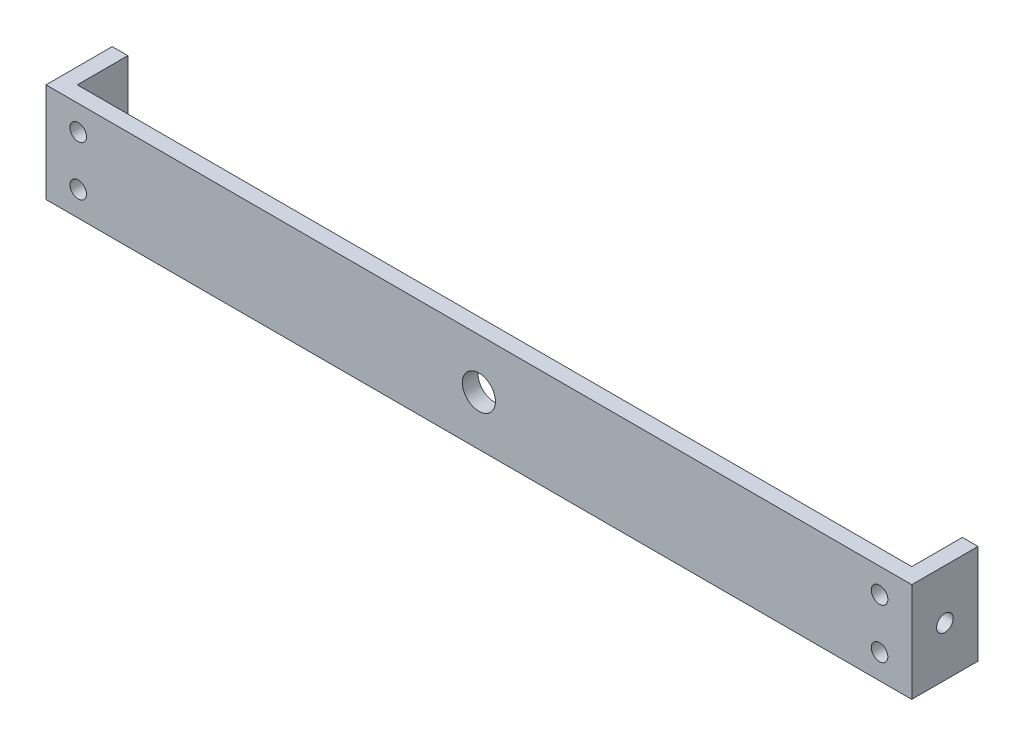
ISO-10303-21;
HEADER;
FILE_DESCRIPTION(('STEP AP214'),'2;1');
FILE_NAME('part.step','',(''),(''),'','','');
FILE_SCHEMA(('AUTOMOTIVE_DESIGN { 1 0 10303 214 1 1 1 1 }'));
ENDSEC;
DATA;
#1=APPLICATION_CONTEXT('core data for automotive mechanical design processes');
#2=APPLICATION_PROTOCOL_DEFINITION('international standard','automotive_design',2000,#1);
#3=PRODUCT_CONTEXT('',#1,'mechanical');
#4=PRODUCT('Part','Part','',(#3));
#5=PRODUCT_RELATED_PRODUCT_CATEGORY('part','',(#4));
#6=PRODUCT_DEFINITION_FORMATION('','',#4);
#7=PRODUCT_DEFINITION_CONTEXT('part definition',#1,'design');
#8=PRODUCT_DEFINITION('design','',#6,#7);
#9=PRODUCT_DEFINITION_SHAPE('','',#8);
#10=(LENGTH_UNIT() NAMED_UNIT(*) SI_UNIT(.MILLI.,.METRE.));
#11=(NAMED_UNIT(*) PLANE_ANGLE_UNIT() SI_UNIT($,.RADIAN.));
#12=(NAMED_UNIT(*) SI_UNIT($,.STERADIAN.) SOLID_ANGLE_UNIT());
#13=UNCERTAINTY_MEASURE_WITH_UNIT(LENGTH_MEASURE(1.E-05),#10,'distance_accuracy_value','');
#14=(GEOMETRIC_REPRESENTATION_CONTEXT(3) GLOBAL_UNCERTAINTY_ASSIGNED_CONTEXT((#13)) GLOBAL_UNIT_ASSIGNED_CONTEXT((#10,
#11,#12)) REPRESENTATION_CONTEXT('',''));
#15=CARTESIAN_POINT('',(0.,0.,0.));
#16=DIRECTION('',(0.,0.,1.));
#17=DIRECTION('',(1.,0.,0.));
#18=AXIS2_PLACEMENT_3D('',#15,#16,#17);
#19=CARTESIAN_POINT('',(0.,0.,6.));
#20=DIRECTION('',(0.,0.,1.));
#21=DIRECTION('',(1.,0.,0.));
#22=AXIS2_PLACEMENT_3D('',#19,#20,#21);
#23=PLANE('',#22);
#24=CARTESIAN_POINT('',(-153.65,-9.52499999999999,6.));
#25=DIRECTION('',(0.,0.,1.));
#26=DIRECTION('',(1.,0.,0.));
#27=AXIS2_PLACEMENT_3D('',#24,#25,#26);
#28=CIRCLE('',#27,3.175);
#29=CARTESIAN_POINT('',(-150.475,-9.52499999999999,6.));
#30=VERTEX_POINT('',#29);
#31=EDGE_CURVE('E375',#30,#30,#28,.T.);
#32=ORIENTED_EDGE('',*,*,#31,.F.);
#33=EDGE_LOOP('',(#32));
#34=FACE_BOUND('',#33,.T.);
#35=CARTESIAN_POINT('',(153.65,-9.52499999999999,6.));
#36=DIRECTION('',(0.,0.,1.));
#37=DIRECTION('',(1.,0.,0.));
#38=AXIS2_PLACEMENT_3D('',#35,#36,#37);
#39=CIRCLE('',#38,3.175);
#40=CARTESIAN_POINT('',(156.825,-9.52499999999999,6.));
#41=VERTEX_POINT('',#40);
#42=EDGE_CURVE('E372',#41,#41,#39,.T.);
#43=ORIENTED_EDGE('',*,*,#42,.F.);
#44=EDGE_LOOP('',(#43));
#45=FACE_BOUND('',#44,.T.);
#46=CARTESIAN_POINT('',(153.65,9.52500000000004,6.));
#47=DIRECTION('',(0.,0.,1.));
#48=DIRECTION('',(1.,0.,0.));
#49=AXIS2_PLACEMENT_3D('',#46,#47,#48);
#50=CIRCLE('',#49,3.175);
#51=CARTESIAN_POINT('',(156.825,9.52500000000004,6.));
#52=VERTEX_POINT('',#51);
#53=EDGE_CURVE('E364',#52,#52,#50,.T.);
#54=ORIENTED_EDGE('',*,*,#53,.F.);
#55=EDGE_LOOP('',(#54));
#56=FACE_BOUND('',#55,.T.);
#57=CARTESIAN_POINT('',(-153.65,9.52500000000004,6.));
#58=DIRECTION('',(0.,0.,1.));
#59=DIRECTION('',(1.,0.,0.));
#60=AXIS2_PLACEMENT_3D('',#57,#58,#59);
#61=CIRCLE('',#60,3.175);
#62=CARTESIAN_POINT('',(-150.475,9.52500000000004,6.));
#63=VERTEX_POINT('',#62);
#64=EDGE_CURVE('E124',#63,#63,#61,.T.);
#65=ORIENTED_EDGE('',*,*,#64,.F.);
#66=EDGE_LOOP('',(#65));
#67=FACE_BOUND('',#66,.T.);
#68=DIRECTION('',(-1.,0.,0.));
#69=VECTOR('',#68,1.);
#70=CARTESIAN_POINT('',(160.,19.0500000000001,6.));
#71=LINE('',#70,#69);
#72=CARTESIAN_POINT('',(166.,19.0500000000001,6.));
#73=VERTEX_POINT('',#72);
#74=CARTESIAN_POINT('',(-166.,19.05,6.));
#75=VERTEX_POINT('',#74);
#76=EDGE_CURVE('E11',#73,#75,#71,.T.);
#77=ORIENTED_EDGE('',*,*,#76,.T.);
#78=DIRECTION('',(0.,-1.,0.));
#79=VECTOR('',#78,1.);
#80=CARTESIAN_POINT('',(-166.,19.05,6.));
#81=LINE('',#80,#79);
#82=CARTESIAN_POINT('',(-166.,-19.05,6.));
#83=VERTEX_POINT('',#82);
#84=EDGE_CURVE('E121',#75,#83,#81,.T.);
#85=ORIENTED_EDGE('',*,*,#84,.T.);
#86=DIRECTION('',(1.,0.,0.));
#87=VECTOR('',#86,1.);
#88=CARTESIAN_POINT('',(160.,-19.05,6.));
#89=LINE('',#88,#87);
#90=CARTESIAN_POINT('',(166.,-19.05,6.));
#91=VERTEX_POINT('',#90);
#92=EDGE_CURVE('E42',#83,#91,#89,.T.);
#93=ORIENTED_EDGE('',*,*,#92,.T.);
#94=DIRECTION('',(0.,1.,0.));
#95=VECTOR('',#94,1.);
#96=CARTESIAN_POINT('',(166.,19.0500000000001,6.));
#97=LINE('',#96,#95);
#98=EDGE_CURVE('E132',#91,#73,#97,.T.);
#99=ORIENTED_EDGE('',*,*,#98,.T.);
#100=EDGE_LOOP('',(#77,#85,#93,#99));
#101=FACE_BOUND('',#100,.T.);
#102=CARTESIAN_POINT('',(0.,0.,6.));
#103=DIRECTION('',(0.,0.,1.));
#104=DIRECTION('',(1.,0.,0.));
#105=AXIS2_PLACEMENT_3D('',#102,#103,#104);
#106=CIRCLE('',#105,6.35);
#107=CARTESIAN_POINT('',(6.35000000000006,0.,6.));
#108=VERTEX_POINT('',#107);
#109=EDGE_CURVE('E163',#108,#108,#106,.T.);
#110=ORIENTED_EDGE('',*,*,#109,.F.);
#111=EDGE_LOOP('',(#110));
#112=FACE_BOUND('',#111,.T.);
#113=ADVANCED_FACE('F33',(#34,#45,#56,#67,#101,#112),#23,.T.);
#114=CARTESIAN_POINT('',(0.,0.,0.));
#115=DIRECTION('',(0.,0.,1.));
#116=DIRECTION('',(1.,0.,0.));
#117=AXIS2_PLACEMENT_3D('',#114,#115,#116);
#118=PLANE('',#117);
#119=CARTESIAN_POINT('',(-153.65,-9.52499999999999,0.));
#120=DIRECTION('',(0.,0.,-1.));
#121=DIRECTION('',(-1.,0.,0.));
#122=AXIS2_PLACEMENT_3D('',#119,#120,#121);
#123=CIRCLE('',#122,3.175);
#124=CARTESIAN_POINT('',(-156.825,-9.52499999999999,0.));
#125=VERTEX_POINT('',#124);
#126=EDGE_CURVE('E361',#125,#125,#123,.T.);
#127=ORIENTED_EDGE('',*,*,#126,.F.);
#128=EDGE_LOOP('',(#127));
#129=FACE_BOUND('',#128,.T.);
#130=CARTESIAN_POINT('',(153.65,-9.52499999999999,0.));
#131=DIRECTION('',(0.,0.,-1.));
#132=DIRECTION('',(1.,0.,0.));
#133=AXIS2_PLACEMENT_3D('',#130,#131,#132);
#134=CIRCLE('',#133,3.175);
#135=CARTESIAN_POINT('',(156.825,-9.52499999999999,0.));
#136=VERTEX_POINT('',#135);
#137=EDGE_CURVE('E365',#136,#136,#134,.T.);
#138=ORIENTED_EDGE('',*,*,#137,.F.);
#139=EDGE_LOOP('',(#138));
#140=FACE_BOUND('',#139,.T.);
#141=CARTESIAN_POINT('',(153.65,9.52500000000004,0.));
#142=DIRECTION('',(0.,0.,-1.));
#143=DIRECTION('',(1.,0.,0.));
#144=AXIS2_PLACEMENT_3D('',#141,#142,#143);
#145=CIRCLE('',#144,3.175);
#146=CARTESIAN_POINT('',(156.825,9.52500000000004,0.));
#147=VERTEX_POINT('',#146);
#148=EDGE_CURVE('E360',#147,#147,#145,.T.);
#149=ORIENTED_EDGE('',*,*,#148,.F.);
#150=EDGE_LOOP('',(#149));
#151=FACE_BOUND('',#150,.T.);
#152=CARTESIAN_POINT('',(-153.65,9.52500000000004,0.));
#153=DIRECTION('',(0.,0.,-1.));
#154=DIRECTION('',(-1.,0.,0.));
#155=AXIS2_PLACEMENT_3D('',#152,#153,#154);
#156=CIRCLE('',#155,3.175);
#157=CARTESIAN_POINT('',(-156.825,9.52500000000004,0.));
#158=VERTEX_POINT('',#157);
#159=EDGE_CURVE('E377',#158,#158,#156,.T.);
#160=ORIENTED_EDGE('',*,*,#159,.F.);
#161=EDGE_LOOP('',(#160));
#162=FACE_BOUND('',#161,.T.);
#163=DIRECTION('',(0.,-1.,0.));
#164=VECTOR('',#163,1.);
#165=CARTESIAN_POINT('',(-160.,-19.05,0.));
#166=LINE('',#165,#164);
#167=CARTESIAN_POINT('',(-160.,19.05,0.));
#168=VERTEX_POINT('',#167);
#169=CARTESIAN_POINT('',(-160.,-19.05,0.));
#170=VERTEX_POINT('',#169);
#171=EDGE_CURVE('E166',#168,#170,#166,.T.);
#172=ORIENTED_EDGE('',*,*,#171,.F.);
#173=DIRECTION('',(-1.,0.,0.));
#174=VECTOR('',#173,1.);
#175=CARTESIAN_POINT('',(160.,19.0500000000001,0.));
#176=LINE('',#175,#174);
#177=CARTESIAN_POINT('',(160.,19.0500000000001,0.));
#178=VERTEX_POINT('',#177);
#179=EDGE_CURVE('E50',#178,#168,#176,.T.);
#180=ORIENTED_EDGE('',*,*,#179,.F.);
#181=DIRECTION('',(0.,1.,0.));
#182=VECTOR('',#181,1.);
#183=CARTESIAN_POINT('',(160.,-19.05,0.));
#184=LINE('',#183,#182);
#185=CARTESIAN_POINT('',(160.,-19.05,0.));
#186=VERTEX_POINT('',#185);
#187=EDGE_CURVE('E172',#186,#178,#184,.T.);
#188=ORIENTED_EDGE('',*,*,#187,.F.);
#189=DIRECTION('',(1.,0.,0.));
#190=VECTOR('',#189,1.);
#191=CARTESIAN_POINT('',(160.,-19.05,0.));
#192=LINE('',#191,#190);
#193=EDGE_CURVE('E58',#170,#186,#192,.T.);
#194=ORIENTED_EDGE('',*,*,#193,.F.);
#195=EDGE_LOOP('',(#172,#180,#188,#194));
#196=FACE_BOUND('',#195,.T.);
#197=CARTESIAN_POINT('',(0.,0.,0.));
#198=DIRECTION('',(0.,0.,1.));
#199=DIRECTION('',(1.,0.,0.));
#200=AXIS2_PLACEMENT_3D('',#197,#198,#199);
#201=CIRCLE('',#200,6.35);
#202=CARTESIAN_POINT('',(6.35000000000006,0.,0.));
#203=VERTEX_POINT('',#202);
#204=EDGE_CURVE('E154',#203,#203,#201,.T.);
#205=ORIENTED_EDGE('',*,*,#204,.T.);
#206=EDGE_LOOP('',(#205));
#207=FACE_BOUND('',#206,.T.);
#208=ADVANCED_FACE('F204',(#129,#140,#151,#162,#196,#207),#118,.F.);
#209=CARTESIAN_POINT('',(160.,-19.05,6.));
#210=DIRECTION('',(0.,1.,0.));
#211=DIRECTION('',(-1.,0.,0.));
#212=AXIS2_PLACEMENT_3D('',#209,#210,#211);
#213=PLANE('',#212);
#214=ORIENTED_EDGE('',*,*,#193,.T.);
#215=DIRECTION('',(0.,0.,1.));
#216=VECTOR('',#215,1.);
#217=CARTESIAN_POINT('',(160.,-19.05,-19.4));
#218=LINE('',#217,#216);
#219=CARTESIAN_POINT('',(160.,-19.05,-19.4));
#220=VERTEX_POINT('',#219);
#221=EDGE_CURVE('E149',#220,#186,#218,.T.);
#222=ORIENTED_EDGE('',*,*,#221,.F.);
#223=DIRECTION('',(1.,0.,0.));
#224=VECTOR('',#223,1.);
#225=CARTESIAN_POINT('',(160.,-19.05,-19.4));
#226=LINE('',#225,#224);
#227=CARTESIAN_POINT('',(166.,-19.05,-19.4));
#228=VERTEX_POINT('',#227);
#229=EDGE_CURVE('E140',#220,#228,#226,.T.);
#230=ORIENTED_EDGE('',*,*,#229,.T.);
#231=DIRECTION('',(0.,0.,1.));
#232=VECTOR('',#231,1.);
#233=CARTESIAN_POINT('',(166.,-19.05,-19.4));
#234=LINE('',#233,#232);
#235=EDGE_CURVE('E158',#228,#91,#234,.T.);
#236=ORIENTED_EDGE('',*,*,#235,.T.);
#237=ORIENTED_EDGE('',*,*,#92,.F.);
#238=DIRECTION('',(0.,0.,1.));
#239=VECTOR('',#238,1.);
#240=CARTESIAN_POINT('',(-166.,-19.05,-19.4));
#241=LINE('',#240,#239);
#242=CARTESIAN_POINT('',(-166.,-19.05,-19.4));
#243=VERTEX_POINT('',#242);
#244=EDGE_CURVE('E133',#243,#83,#241,.T.);
#245=ORIENTED_EDGE('',*,*,#244,.F.);
#246=DIRECTION('',(1.,0.,0.));
#247=VECTOR('',#246,1.);
#248=CARTESIAN_POINT('',(-160.,-19.05,-19.4));
#249=LINE('',#248,#247);
#250=CARTESIAN_POINT('',(-160.,-19.05,-19.4));
#251=VERTEX_POINT('',#250);
#252=EDGE_CURVE('E107',#243,#251,#249,.T.);
#253=ORIENTED_EDGE('',*,*,#252,.T.);
#254=DIRECTION('',(0.,0.,1.));
#255=VECTOR('',#254,1.);
#256=CARTESIAN_POINT('',(-160.,-19.05,-19.4));
#257=LINE('',#256,#255);
#258=EDGE_CURVE('E120',#251,#170,#257,.T.);
#259=ORIENTED_EDGE('',*,*,#258,.T.);
#260=EDGE_LOOP('',(#214,#222,#230,#236,#237,#245,#253,#259));
#261=FACE_BOUND('',#260,.T.);
#262=ADVANCED_FACE('F35',(#261),#213,.F.);
#263=CARTESIAN_POINT('',(160.,19.0500000000001,6.));
#264=DIRECTION('',(0.,-1.,0.));
#265=DIRECTION('',(1.,0.,0.));
#266=AXIS2_PLACEMENT_3D('',#263,#264,#265);
#267=PLANE('',#266);
#268=ORIENTED_EDGE('',*,*,#179,.T.);
#269=DIRECTION('',(0.,0.,1.));
#270=VECTOR('',#269,1.);
#271=CARTESIAN_POINT('',(-160.,19.05,-19.4));
#272=LINE('',#271,#270);
#273=CARTESIAN_POINT('',(-160.,19.05,-19.4));
#274=VERTEX_POINT('',#273);
#275=EDGE_CURVE('E98',#274,#168,#272,.T.);
#276=ORIENTED_EDGE('',*,*,#275,.F.);
#277=DIRECTION('',(-1.,0.,0.));
#278=VECTOR('',#277,1.);
#279=CARTESIAN_POINT('',(-160.,19.05,-19.4));
#280=LINE('',#279,#278);
#281=CARTESIAN_POINT('',(-166.,19.05,-19.4));
#282=VERTEX_POINT('',#281);
#283=EDGE_CURVE('E102',#274,#282,#280,.T.);
#284=ORIENTED_EDGE('',*,*,#283,.T.);
#285=DIRECTION('',(0.,0.,1.));
#286=VECTOR('',#285,1.);
#287=CARTESIAN_POINT('',(-166.,19.05,-19.4));
#288=LINE('',#287,#286);
#289=EDGE_CURVE('E106',#282,#75,#288,.T.);
#290=ORIENTED_EDGE('',*,*,#289,.T.);
#291=ORIENTED_EDGE('',*,*,#76,.F.);
#292=DIRECTION('',(0.,0.,1.));
#293=VECTOR('',#292,1.);
#294=CARTESIAN_POINT('',(166.,19.0500000000001,-19.4));
#295=LINE('',#294,#293);
#296=CARTESIAN_POINT('',(166.,19.0500000000001,-19.4));
#297=VERTEX_POINT('',#296);
#298=EDGE_CURVE('E155',#297,#73,#295,.T.);
#299=ORIENTED_EDGE('',*,*,#298,.F.);
#300=DIRECTION('',(-1.,0.,0.));
#301=VECTOR('',#300,1.);
#302=CARTESIAN_POINT('',(160.,19.0500000000001,-19.4));
#303=LINE('',#302,#301);
#304=CARTESIAN_POINT('',(160.,19.0500000000001,-19.4));
#305=VERTEX_POINT('',#304);
#306=EDGE_CURVE('E146',#297,#305,#303,.T.);
#307=ORIENTED_EDGE('',*,*,#306,.T.);
#308=DIRECTION('',(0.,0.,1.));
#309=VECTOR('',#308,1.);
#310=CARTESIAN_POINT('',(160.,19.0500000000001,-19.4));
#311=LINE('',#310,#309);
#312=EDGE_CURVE('E152',#305,#178,#311,.T.);
#313=ORIENTED_EDGE('',*,*,#312,.T.);
#314=EDGE_LOOP('',(#268,#276,#284,#290,#291,#299,#307,#313));
#315=FACE_BOUND('',#314,.T.);
#316=ADVANCED_FACE('F100',(#315),#267,.F.);
#317=CARTESIAN_POINT('',(0.,0.,6.));
#318=DIRECTION('',(0.,0.,-1.));
#319=DIRECTION('',(-1.,0.,0.));
#320=AXIS2_PLACEMENT_3D('',#317,#318,#319);
#321=CYLINDRICAL_SURFACE('',#320,6.35);
#322=ORIENTED_EDGE('',*,*,#109,.T.);
#323=EDGE_LOOP('',(#322));
#324=FACE_BOUND('',#323,.T.);
#325=ORIENTED_EDGE('',*,*,#204,.F.);
#326=EDGE_LOOP('',(#325));
#327=FACE_BOUND('',#326,.T.);
#328=ADVANCED_FACE('F217',(#324,#327),#321,.F.);
#329=CARTESIAN_POINT('',(160.,19.0500000000001,-19.4));
#330=DIRECTION('',(-1.,0.,0.));
#331=DIRECTION('',(0.,0.,1.));
#332=AXIS2_PLACEMENT_3D('',#329,#330,#331);
#333=PLANE('',#332);
#334=CARTESIAN_POINT('',(160.,0.,-6.7));
#335=DIRECTION('',(-1.,0.,0.));
#336=DIRECTION('',(0.,0.,1.));
#337=AXIS2_PLACEMENT_3D('',#334,#335,#336);
#338=CIRCLE('',#337,3.17500000000015);
#339=CARTESIAN_POINT('',(160.,0.,-9.87500000000015));
#340=VERTEX_POINT('',#339);
#341=EDGE_CURVE('E349',#340,#340,#338,.T.);
#342=ORIENTED_EDGE('',*,*,#341,.F.);
#343=EDGE_LOOP('',(#342));
#344=FACE_BOUND('',#343,.T.);
#345=ORIENTED_EDGE('',*,*,#221,.T.);
#346=ORIENTED_EDGE('',*,*,#187,.T.);
#347=ORIENTED_EDGE('',*,*,#312,.F.);
#348=DIRECTION('',(0.,-1.,0.));
#349=VECTOR('',#348,1.);
#350=CARTESIAN_POINT('',(160.,19.0500000000001,-19.4));
#351=LINE('',#350,#349);
#352=EDGE_CURVE('E137',#305,#220,#351,.T.);
#353=ORIENTED_EDGE('',*,*,#352,.T.);
#354=EDGE_LOOP('',(#345,#346,#347,#353));
#355=FACE_BOUND('',#354,.T.);
#356=ADVANCED_FACE('F175',(#344,#355),#333,.T.);
#357=CARTESIAN_POINT('',(166.,19.0500000000001,-19.4));
#358=DIRECTION('',(1.,0.,0.));
#359=DIRECTION('',(0.,0.,-1.));
#360=AXIS2_PLACEMENT_3D('',#357,#358,#359);
#361=PLANE('',#360);
#362=CARTESIAN_POINT('',(166.,0.,-6.7));
#363=DIRECTION('',(1.,0.,0.));
#364=DIRECTION('',(0.,0.,-1.));
#365=AXIS2_PLACEMENT_3D('',#362,#363,#364);
#366=CIRCLE('',#365,3.17500000000015);
#367=CARTESIAN_POINT('',(166.,0.,-9.87500000000015));
#368=VERTEX_POINT('',#367);
#369=EDGE_CURVE('E352',#368,#368,#366,.T.);
#370=ORIENTED_EDGE('',*,*,#369,.F.);
#371=EDGE_LOOP('',(#370));
#372=FACE_BOUND('',#371,.T.);
#373=ORIENTED_EDGE('',*,*,#98,.F.);
#374=ORIENTED_EDGE('',*,*,#235,.F.);
#375=DIRECTION('',(0.,1.,0.));
#376=VECTOR('',#375,1.);
#377=CARTESIAN_POINT('',(166.,19.0500000000001,-19.4));
#378=LINE('',#377,#376);
#379=EDGE_CURVE('E143',#228,#297,#378,.T.);
#380=ORIENTED_EDGE('',*,*,#379,.T.);
#381=ORIENTED_EDGE('',*,*,#298,.T.);
#382=EDGE_LOOP('',(#373,#374,#380,#381));
#383=FACE_BOUND('',#382,.T.);
#384=ADVANCED_FACE('F185',(#372,#383),#361,.T.);
#385=CARTESIAN_POINT('',(0.,0.,-19.4));
#386=DIRECTION('',(0.,0.,1.));
#387=DIRECTION('',(1.,0.,0.));
#388=AXIS2_PLACEMENT_3D('',#385,#386,#387);
#389=PLANE('',#388);
#390=ORIENTED_EDGE('',*,*,#352,.F.);
#391=ORIENTED_EDGE('',*,*,#306,.F.);
#392=ORIENTED_EDGE('',*,*,#379,.F.);
#393=ORIENTED_EDGE('',*,*,#229,.F.);
#394=EDGE_LOOP('',(#390,#391,#392,#393));
#395=FACE_BOUND('',#394,.T.);
#396=ADVANCED_FACE('F181',(#395),#389,.F.);
#397=CARTESIAN_POINT('',(-160.,19.05,-19.4));
#398=DIRECTION('',(1.,0.,0.));
#399=DIRECTION('',(0.,0.,-1.));
#400=AXIS2_PLACEMENT_3D('',#397,#398,#399);
#401=PLANE('',#400);
#402=CARTESIAN_POINT('',(-160.,0.,-6.7));
#403=DIRECTION('',(1.,0.,0.));
#404=DIRECTION('',(0.,0.,-1.));
#405=AXIS2_PLACEMENT_3D('',#402,#403,#404);
#406=CIRCLE('',#405,3.17500000000015);
#407=CARTESIAN_POINT('',(-160.,0.,-9.87500000000015));
#408=VERTEX_POINT('',#407);
#409=EDGE_CURVE('E355',#408,#408,#406,.T.);
#410=ORIENTED_EDGE('',*,*,#409,.F.);
#411=EDGE_LOOP('',(#410));
#412=FACE_BOUND('',#411,.T.);
#413=ORIENTED_EDGE('',*,*,#275,.T.);
#414=ORIENTED_EDGE('',*,*,#171,.T.);
#415=ORIENTED_EDGE('',*,*,#258,.F.);
#416=DIRECTION('',(0.,1.,0.));
#417=VECTOR('',#416,1.);
#418=CARTESIAN_POINT('',(-160.,19.05,-19.4));
#419=LINE('',#418,#417);
#420=EDGE_CURVE('E114',#251,#274,#419,.T.);
#421=ORIENTED_EDGE('',*,*,#420,.T.);
#422=EDGE_LOOP('',(#413,#414,#415,#421));
#423=FACE_BOUND('',#422,.T.);
#424=ADVANCED_FACE('F119',(#412,#423),#401,.T.);
#425=CARTESIAN_POINT('',(-166.,19.05,-19.4));
#426=DIRECTION('',(-1.,0.,0.));
#427=DIRECTION('',(0.,0.,1.));
#428=AXIS2_PLACEMENT_3D('',#425,#426,#427);
#429=PLANE('',#428);
#430=CARTESIAN_POINT('',(-166.,0.,-6.7));
#431=DIRECTION('',(-1.,0.,0.));
#432=DIRECTION('',(0.,0.,1.));
#433=AXIS2_PLACEMENT_3D('',#430,#431,#432);
#434=CIRCLE('',#433,3.17500000000015);
#435=CARTESIAN_POINT('',(-166.,0.,-9.87500000000015));
#436=VERTEX_POINT('',#435);
#437=EDGE_CURVE('E37',#436,#436,#434,.T.);
#438=ORIENTED_EDGE('',*,*,#437,.F.);
#439=EDGE_LOOP('',(#438));
#440=FACE_BOUND('',#439,.T.);
#441=ORIENTED_EDGE('',*,*,#84,.F.);
#442=ORIENTED_EDGE('',*,*,#289,.F.);
#443=DIRECTION('',(0.,-1.,0.));
#444=VECTOR('',#443,1.);
#445=CARTESIAN_POINT('',(-166.,19.05,-19.4));
#446=LINE('',#445,#444);
#447=EDGE_CURVE('E117',#282,#243,#446,.T.);
#448=ORIENTED_EDGE('',*,*,#447,.T.);
#449=ORIENTED_EDGE('',*,*,#244,.T.);
#450=EDGE_LOOP('',(#441,#442,#448,#449));
#451=FACE_BOUND('',#450,.T.);
#452=ADVANCED_FACE('F190',(#440,#451),#429,.T.);
#453=CARTESIAN_POINT('',(0.,0.,-19.4));
#454=DIRECTION('',(0.,0.,-1.));
#455=DIRECTION('',(-1.,0.,0.));
#456=AXIS2_PLACEMENT_3D('',#453,#454,#455);
#457=PLANE('',#456);
#458=ORIENTED_EDGE('',*,*,#420,.F.);
#459=ORIENTED_EDGE('',*,*,#252,.F.);
#460=ORIENTED_EDGE('',*,*,#447,.F.);
#461=ORIENTED_EDGE('',*,*,#283,.F.);
#462=EDGE_LOOP('',(#458,#459,#460,#461));
#463=FACE_BOUND('',#462,.T.);
#464=ADVANCED_FACE('F112',(#463),#457,.T.);
#465=CARTESIAN_POINT('',(-153.65,9.52500000000004,25.4));
#466=DIRECTION('',(0.,0.,-1.));
#467=DIRECTION('',(-1.,0.,0.));
#468=AXIS2_PLACEMENT_3D('',#465,#466,#467);
#469=CYLINDRICAL_SURFACE('',#468,3.175);
#470=ORIENTED_EDGE('',*,*,#64,.T.);
#471=EDGE_LOOP('',(#470));
#472=FACE_BOUND('',#471,.T.);
#473=ORIENTED_EDGE('',*,*,#159,.T.);
#474=EDGE_LOOP('',(#473));
#475=FACE_BOUND('',#474,.T.);
#476=ADVANCED_FACE('F198',(#472,#475),#469,.F.);
#477=CARTESIAN_POINT('',(153.65,9.52500000000004,25.4));
#478=DIRECTION('',(0.,0.,-1.));
#479=DIRECTION('',(-1.,0.,0.));
#480=AXIS2_PLACEMENT_3D('',#477,#478,#479);
#481=CYLINDRICAL_SURFACE('',#480,3.175);
#482=ORIENTED_EDGE('',*,*,#53,.T.);
#483=EDGE_LOOP('',(#482));
#484=FACE_BOUND('',#483,.T.);
#485=ORIENTED_EDGE('',*,*,#148,.T.);
#486=EDGE_LOOP('',(#485));
#487=FACE_BOUND('',#486,.T.);
#488=ADVANCED_FACE('F272',(#484,#487),#481,.F.);
#489=CARTESIAN_POINT('',(153.65,-9.52499999999999,25.4));
#490=DIRECTION('',(0.,0.,-1.));
#491=DIRECTION('',(-1.,0.,0.));
#492=AXIS2_PLACEMENT_3D('',#489,#490,#491);
#493=CYLINDRICAL_SURFACE('',#492,3.175);
#494=ORIENTED_EDGE('',*,*,#42,.T.);
#495=EDGE_LOOP('',(#494));
#496=FACE_BOUND('',#495,.T.);
#497=ORIENTED_EDGE('',*,*,#137,.T.);
#498=EDGE_LOOP('',(#497));
#499=FACE_BOUND('',#498,.T.);
#500=ADVANCED_FACE('F282',(#496,#499),#493,.F.);
#501=CARTESIAN_POINT('',(-153.65,-9.52499999999999,25.4));
#502=DIRECTION('',(0.,0.,-1.));
#503=DIRECTION('',(-1.,0.,0.));
#504=AXIS2_PLACEMENT_3D('',#501,#502,#503);
#505=CYLINDRICAL_SURFACE('',#504,3.175);
#506=ORIENTED_EDGE('',*,*,#31,.T.);
#507=EDGE_LOOP('',(#506));
#508=FACE_BOUND('',#507,.T.);
#509=ORIENTED_EDGE('',*,*,#126,.T.);
#510=EDGE_LOOP('',(#509));
#511=FACE_BOUND('',#510,.T.);
#512=ADVANCED_FACE('F292',(#508,#511),#505,.F.);
#513=CARTESIAN_POINT('',(-182.712979417389,0.,-6.7));
#514=DIRECTION('',(1.,0.,0.));
#515=DIRECTION('',(0.,0.,-1.));
#516=AXIS2_PLACEMENT_3D('',#513,#514,#515);
#517=CYLINDRICAL_SURFACE('',#516,3.17500000000015);
#518=CARTESIAN_POINT('',(-160.,0.,-9.87500000000015));
#519=CARTESIAN_POINT('',(-160.0625,0.,-9.87500000000015));
#520=CARTESIAN_POINT('',(-160.125,0.,-9.87500000000015));
#521=CARTESIAN_POINT('',(-160.25,0.,-9.87500000000015));
#522=CARTESIAN_POINT('',(-160.3125,0.,-9.87500000000015));
#523=CARTESIAN_POINT('',(-160.4375,0.,-9.87500000000015));
#524=CARTESIAN_POINT('',(-160.5,0.,-9.87500000000015));
#525=CARTESIAN_POINT('',(-160.625,0.,-9.87500000000015));
#526=CARTESIAN_POINT('',(-160.6875,0.,-9.87500000000015));
#527=CARTESIAN_POINT('',(-160.8125,0.,-9.87500000000015));
#528=CARTESIAN_POINT('',(-160.875,0.,-9.87500000000015));
#529=CARTESIAN_POINT('',(-161.,0.,-9.87500000000015));
#530=CARTESIAN_POINT('',(-161.0625,0.,-9.87500000000015));
#531=CARTESIAN_POINT('',(-161.1875,0.,-9.87500000000015));
#532=CARTESIAN_POINT('',(-161.25,0.,-9.87500000000015));
#533=CARTESIAN_POINT('',(-161.375,0.,-9.87500000000015));
#534=CARTESIAN_POINT('',(-161.4375,0.,-9.87500000000015));
#535=CARTESIAN_POINT('',(-161.5625,0.,-9.87500000000015));
#536=CARTESIAN_POINT('',(-161.625,0.,-9.87500000000015));
#537=CARTESIAN_POINT('',(-161.75,0.,-9.87500000000015));
#538=CARTESIAN_POINT('',(-161.8125,0.,-9.87500000000015));
#539=CARTESIAN_POINT('',(-161.9375,0.,-9.87500000000015));
#540=CARTESIAN_POINT('',(-162.,0.,-9.87500000000015));
#541=CARTESIAN_POINT('',(-162.125,0.,-9.87500000000015));
#542=CARTESIAN_POINT('',(-162.1875,0.,-9.87500000000015));
#543=CARTESIAN_POINT('',(-162.3125,0.,-9.87500000000015));
#544=CARTESIAN_POINT('',(-162.375,0.,-9.87500000000015));
#545=CARTESIAN_POINT('',(-162.5,0.,-9.87500000000015));
#546=CARTESIAN_POINT('',(-162.5625,0.,-9.87500000000015));
#547=CARTESIAN_POINT('',(-162.6875,0.,-9.87500000000015));
#548=CARTESIAN_POINT('',(-162.75,0.,-9.87500000000015));
#549=CARTESIAN_POINT('',(-162.875,0.,-9.87500000000015));
#550=CARTESIAN_POINT('',(-162.9375,0.,-9.87500000000015));
#551=CARTESIAN_POINT('',(-163.0625,0.,-9.87500000000015));
#552=CARTESIAN_POINT('',(-163.125,0.,-9.87500000000015));
#553=CARTESIAN_POINT('',(-163.25,0.,-9.87500000000015));
#554=CARTESIAN_POINT('',(-163.3125,0.,-9.87500000000015));
#555=CARTESIAN_POINT('',(-163.4375,0.,-9.87500000000015));
#556=CARTESIAN_POINT('',(-163.5,0.,-9.87500000000015));
#557=CARTESIAN_POINT('',(-163.625,0.,-9.87500000000015));
#558=CARTESIAN_POINT('',(-163.6875,0.,-9.87500000000015));
#559=CARTESIAN_POINT('',(-163.8125,0.,-9.87500000000015));
#560=CARTESIAN_POINT('',(-163.875,0.,-9.87500000000015));
#561=CARTESIAN_POINT('',(-164.,0.,-9.87500000000015));
#562=CARTESIAN_POINT('',(-164.0625,0.,-9.87500000000015));
#563=CARTESIAN_POINT('',(-164.1875,0.,-9.87500000000015));
#564=CARTESIAN_POINT('',(-164.25,0.,-9.87500000000015));
#565=CARTESIAN_POINT('',(-164.375,0.,-9.87500000000015));
#566=CARTESIAN_POINT('',(-164.4375,0.,-9.87500000000015));
#567=CARTESIAN_POINT('',(-164.5625,0.,-9.87500000000015));
#568=CARTESIAN_POINT('',(-164.625,0.,-9.87500000000015));
#569=CARTESIAN_POINT('',(-164.75,0.,-9.87500000000015));
#570=CARTESIAN_POINT('',(-164.8125,0.,-9.87500000000015));
#571=CARTESIAN_POINT('',(-164.9375,0.,-9.87500000000015));
#572=CARTESIAN_POINT('',(-165.,0.,-9.87500000000015));
#573=CARTESIAN_POINT('',(-165.125,0.,-9.87500000000015));
#574=CARTESIAN_POINT('',(-165.1875,0.,-9.87500000000015));
#575=CARTESIAN_POINT('',(-165.3125,0.,-9.87500000000015));
#576=CARTESIAN_POINT('',(-165.375,0.,-9.87500000000015));
#577=CARTESIAN_POINT('',(-165.5,0.,-9.87500000000015));
#578=CARTESIAN_POINT('',(-165.5625,0.,-9.87500000000015));
#579=CARTESIAN_POINT('',(-165.6875,0.,-9.87500000000015));
#580=CARTESIAN_POINT('',(-165.75,0.,-9.87500000000015));
#581=CARTESIAN_POINT('',(-165.875,0.,-9.87500000000015));
#582=CARTESIAN_POINT('',(-165.9375,0.,-9.87500000000015));
#583=CARTESIAN_POINT('',(-166.,0.,-9.87500000000015));
#584=B_SPLINE_CURVE_WITH_KNOTS('',3,(#518,#519,#520,#521,#522,#523,#524,#525,#526,#527,#528,
#529,#530,#531,#532,#533,#534,#535,#536,#537,#538,#539,#540,#541,#542,#543,#544,#545,#546,#547,
#548,#549,#550,#551,#552,#553,#554,#555,#556,#557,#558,#559,#560,#561,#562,#563,#564,#565,#566,
#567,#568,#569,#570,#571,#572,#573,#574,#575,#576,#577,#578,#579,#580,#581,#582,#583),
.UNSPECIFIED.,.F.,.F.,(4,2,2,2,2,2,2,2,2,2,2,2,2,2,2,2,2,2,2,2,2,2,2,2,2,2,2,2,2,2,2,2,4),(0.,
0.187499999999979,0.374999999999986,0.562499999999994,0.750000000000001,0.93749999999998,
1.12499999999999,1.31249999999999,1.49999999999997,1.68749999999998,1.87499999999999,
2.06249999999997,2.24999999999997,2.43749999999998,2.62499999999999,2.81249999999997,
2.99999999999998,3.18749999999998,3.37499999999996,3.56249999999997,3.74999999999998,
3.93749999999998,4.12499999999996,4.31249999999997,4.49999999999998,4.68749999999996,
4.87499999999996,5.06249999999997,5.24999999999995,5.43749999999996,5.62499999999996,
5.81249999999997,5.99999999999995),.UNSPECIFIED.);
#585=EDGE_CURVE('BSEAM302',#408,#436,#584,.T.);
#586=ORIENTED_EDGE('',*,*,#409,.T.);
#587=ORIENTED_EDGE('',*,*,#437,.T.);
#588=ORIENTED_EDGE('',*,*,#585,.T.);
#589=ORIENTED_EDGE('',*,*,#585,.F.);
#590=EDGE_LOOP('',(#586,#588,#587,#589));
#591=FACE_BOUND('',#590,.T.);
#592=ADVANCED_FACE('F302',(#591),#517,.F.);
#593=CARTESIAN_POINT('',(160.,0.,-9.87500000000015));
#594=CARTESIAN_POINT('',(160.0625,0.,-9.87500000000015));
#595=CARTESIAN_POINT('',(160.125,0.,-9.87500000000015));
#596=CARTESIAN_POINT('',(160.25,0.,-9.87500000000015));
#597=CARTESIAN_POINT('',(160.3125,0.,-9.87500000000015));
#598=CARTESIAN_POINT('',(160.4375,0.,-9.87500000000015));
#599=CARTESIAN_POINT('',(160.5,0.,-9.87500000000015));
#600=CARTESIAN_POINT('',(160.625,0.,-9.87500000000015));
#601=CARTESIAN_POINT('',(160.6875,0.,-9.87500000000015));
#602=CARTESIAN_POINT('',(160.8125,0.,-9.87500000000015));
#603=CARTESIAN_POINT('',(160.875,0.,-9.87500000000015));
#604=CARTESIAN_POINT('',(161.,0.,-9.87500000000015));
#605=CARTESIAN_POINT('',(161.0625,0.,-9.87500000000015));
#606=CARTESIAN_POINT('',(161.1875,0.,-9.87500000000015));
#607=CARTESIAN_POINT('',(161.25,0.,-9.87500000000015));
#608=CARTESIAN_POINT('',(161.375,0.,-9.87500000000015));
#609=CARTESIAN_POINT('',(161.4375,0.,-9.87500000000015));
#610=CARTESIAN_POINT('',(161.5625,0.,-9.87500000000015));
#611=CARTESIAN_POINT('',(161.625,0.,-9.87500000000015));
#612=CARTESIAN_POINT('',(161.75,0.,-9.87500000000015));
#613=CARTESIAN_POINT('',(161.8125,0.,-9.87500000000015));
#614=CARTESIAN_POINT('',(161.9375,0.,-9.87500000000015));
#615=CARTESIAN_POINT('',(162.,0.,-9.87500000000015));
#616=CARTESIAN_POINT('',(162.125,0.,-9.87500000000015));
#617=CARTESIAN_POINT('',(162.1875,0.,-9.87500000000015));
#618=CARTESIAN_POINT('',(162.3125,0.,-9.87500000000015));
#619=CARTESIAN_POINT('',(162.375,0.,-9.87500000000015));
#620=CARTESIAN_POINT('',(162.5,0.,-9.87500000000015));
#621=CARTESIAN_POINT('',(162.5625,0.,-9.87500000000015));
#622=CARTESIAN_POINT('',(162.6875,0.,-9.87500000000015));
#623=CARTESIAN_POINT('',(162.75,0.,-9.87500000000015));
#624=CARTESIAN_POINT('',(162.875,0.,-9.87500000000015));
#625=CARTESIAN_POINT('',(162.9375,0.,-9.87500000000015));
#626=CARTESIAN_POINT('',(163.0625,0.,-9.87500000000015));
#627=CARTESIAN_POINT('',(163.125,0.,-9.87500000000015));
#628=CARTESIAN_POINT('',(163.25,0.,-9.87500000000015));
#629=CARTESIAN_POINT('',(163.3125,0.,-9.87500000000015));
#630=CARTESIAN_POINT('',(163.4375,0.,-9.87500000000015));
#631=CARTESIAN_POINT('',(163.5,0.,-9.87500000000015));
#632=CARTESIAN_POINT('',(163.625,0.,-9.87500000000015));
#633=CARTESIAN_POINT('',(163.6875,0.,-9.87500000000015));
#634=CARTESIAN_POINT('',(163.8125,0.,-9.87500000000015));
#635=CARTESIAN_POINT('',(163.875,0.,-9.87500000000015));
#636=CARTESIAN_POINT('',(164.,0.,-9.87500000000015));
#637=CARTESIAN_POINT('',(164.0625,0.,-9.87500000000015));
#638=CARTESIAN_POINT('',(164.1875,0.,-9.87500000000015));
#639=CARTESIAN_POINT('',(164.25,0.,-9.87500000000015));
#640=CARTESIAN_POINT('',(164.375,0.,-9.87500000000015));
#641=CARTESIAN_POINT('',(164.4375,0.,-9.87500000000015));
#642=CARTESIAN_POINT('',(164.5625,0.,-9.87500000000015));
#643=CARTESIAN_POINT('',(164.625,0.,-9.87500000000015));
#644=CARTESIAN_POINT('',(164.75,0.,-9.87500000000015));
#645=CARTESIAN_POINT('',(164.8125,0.,-9.87500000000015));
#646=CARTESIAN_POINT('',(164.9375,0.,-9.87500000000015));
#647=CARTESIAN_POINT('',(165.,0.,-9.87500000000015));
#648=CARTESIAN_POINT('',(165.125,0.,-9.87500000000015));
#649=CARTESIAN_POINT('',(165.1875,0.,-9.87500000000015));
#650=CARTESIAN_POINT('',(165.3125,0.,-9.87500000000015));
#651=CARTESIAN_POINT('',(165.375,0.,-9.87500000000015));
#652=CARTESIAN_POINT('',(165.5,0.,-9.87500000000015));
#653=CARTESIAN_POINT('',(165.5625,0.,-9.87500000000015));
#654=CARTESIAN_POINT('',(165.6875,0.,-9.87500000000015));
#655=CARTESIAN_POINT('',(165.75,0.,-9.87500000000015));
#656=CARTESIAN_POINT('',(165.875,0.,-9.87500000000015));
#657=CARTESIAN_POINT('',(165.9375,0.,-9.87500000000015));
#658=CARTESIAN_POINT('',(166.,0.,-9.87500000000015));
#659=B_SPLINE_CURVE_WITH_KNOTS('',3,(#593,#594,#595,#596,#597,#598,#599,#600,#601,#602,#603,
#604,#605,#606,#607,#608,#609,#610,#611,#612,#613,#614,#615,#616,#617,#618,#619,#620,#621,#622,
#623,#624,#625,#626,#627,#628,#629,#630,#631,#632,#633,#634,#635,#636,#637,#638,#639,#640,#641,
#642,#643,#644,#645,#646,#647,#648,#649,#650,#651,#652,#653,#654,#655,#656,#657,#658),
.UNSPECIFIED.,.F.,.F.,(4,2,2,2,2,2,2,2,2,2,2,2,2,2,2,2,2,2,2,2,2,2,2,2,2,2,2,2,2,2,2,2,4),(0.,
0.187500000000007,0.375000000000014,0.562499999999966,0.749999999999973,0.93749999999998,
1.12499999999999,1.31249999999999,1.49999999999995,1.68749999999995,1.87499999999996,
2.06249999999997,2.24999999999997,2.43749999999998,2.62499999999993,2.81249999999994,
2.99999999999995,3.18749999999995,3.37499999999996,3.56249999999991,3.74999999999992,
3.93749999999993,4.12499999999993,4.31249999999994,4.49999999999995,4.6874999999999,
4.87499999999991,5.06249999999991,5.24999999999992,5.43749999999993,5.62499999999988,
5.81249999999989,5.99999999999989),.UNSPECIFIED.);
#660=EDGE_CURVE('BSEAM333',#340,#368,#659,.T.);
#661=ORIENTED_EDGE('',*,*,#341,.T.);
#662=ORIENTED_EDGE('',*,*,#369,.T.);
#663=ORIENTED_EDGE('',*,*,#660,.T.);
#664=ORIENTED_EDGE('',*,*,#660,.F.);
#665=EDGE_LOOP('',(#661,#663,#662,#664));
#666=FACE_BOUND('',#665,.T.);
#667=ADVANCED_FACE('F333',(#666),#517,.F.);
#668=CLOSED_SHELL('',(#113,#208,#262,#316,#328,#356,#384,#396,#424,#452,#464,#476,#488,#500,
#512,#592,#667));
#669=MANIFOLD_SOLID_BREP('B2',#668);
#670=ADVANCED_BREP_SHAPE_REPRESENTATION('',(#18,#669),#14);
#671=SHAPE_DEFINITION_REPRESENTATION(#9,#670);
ENDSEC;
END-ISO-10303-21;
